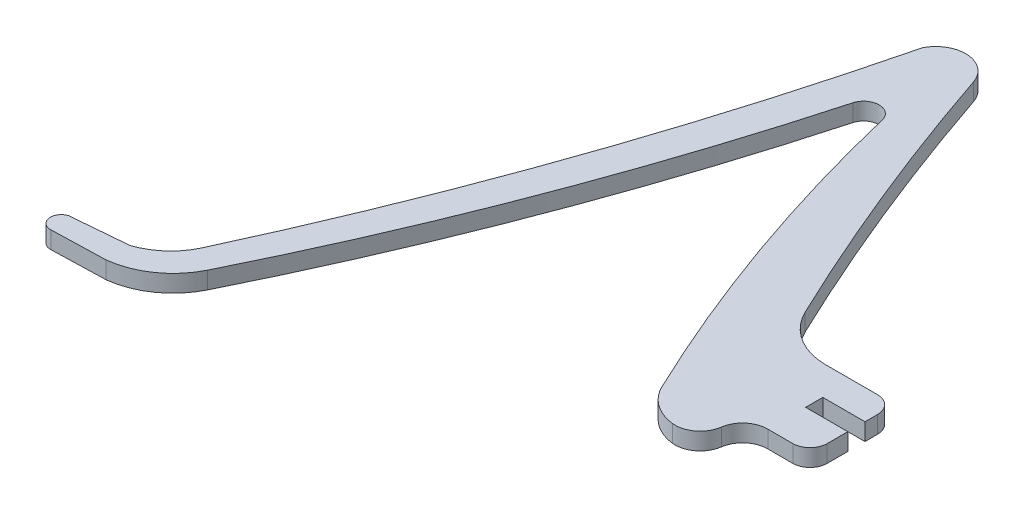
ISO-10303-21;
HEADER;
FILE_DESCRIPTION(('STEP AP214'),'2;1');
FILE_NAME('part.step','',(''),(''),'','','');
FILE_SCHEMA(('AUTOMOTIVE_DESIGN { 1 0 10303 214 1 1 1 1 }'));
ENDSEC;
DATA;
#1=APPLICATION_CONTEXT('core data for automotive mechanical design processes');
#2=APPLICATION_PROTOCOL_DEFINITION('international standard','automotive_design',2000,#1);
#3=PRODUCT_CONTEXT('',#1,'mechanical');
#4=PRODUCT('Part','Part','',(#3));
#5=PRODUCT_RELATED_PRODUCT_CATEGORY('part','',(#4));
#6=PRODUCT_DEFINITION_FORMATION('','',#4);
#7=PRODUCT_DEFINITION_CONTEXT('part definition',#1,'design');
#8=PRODUCT_DEFINITION('design','',#6,#7);
#9=PRODUCT_DEFINITION_SHAPE('','',#8);
#10=(LENGTH_UNIT() NAMED_UNIT(*) SI_UNIT(.MILLI.,.METRE.));
#11=(NAMED_UNIT(*) PLANE_ANGLE_UNIT() SI_UNIT($,.RADIAN.));
#12=(NAMED_UNIT(*) SI_UNIT($,.STERADIAN.) SOLID_ANGLE_UNIT());
#13=UNCERTAINTY_MEASURE_WITH_UNIT(LENGTH_MEASURE(1.E-05),#10,'distance_accuracy_value','');
#14=(GEOMETRIC_REPRESENTATION_CONTEXT(3) GLOBAL_UNCERTAINTY_ASSIGNED_CONTEXT((#13)) GLOBAL_UNIT_ASSIGNED_CONTEXT((#10,
#11,#12)) REPRESENTATION_CONTEXT('',''));
#15=CARTESIAN_POINT('',(0.,0.,0.));
#16=DIRECTION('',(0.,0.,1.));
#17=DIRECTION('',(1.,0.,0.));
#18=AXIS2_PLACEMENT_3D('',#15,#16,#17);
#19=CARTESIAN_POINT('',(-41735.6171870203,3.,-18306.9316403449));
#20=DIRECTION('',(0.,-1.,0.));
#21=DIRECTION('',(0.,0.,-1.));
#22=AXIS2_PLACEMENT_3D('',#19,#20,#21);
#23=CYLINDRICAL_SURFACE('',#22,1.87725100049842);
#24=CARTESIAN_POINT('',(-41735.6171870203,0.,-18306.9316403449));
#25=DIRECTION('',(0.,1.,0.));
#26=DIRECTION('',(0.,0.,1.));
#27=AXIS2_PLACEMENT_3D('',#24,#25,#26);
#28=CIRCLE('',#27,1.87725100049842);
#29=CARTESIAN_POINT('',(-41735.449746,0.,-18308.801409));
#30=VERTEX_POINT('',#29);
#31=CARTESIAN_POINT('',(-41735.564459,0.,-18305.0551299999));
#32=VERTEX_POINT('',#31);
#33=EDGE_CURVE('E227',#30,#32,#28,.T.);
#34=ORIENTED_EDGE('',*,*,#33,.T.);
#35=DIRECTION('',(0.,-1.,0.));
#36=VECTOR('',#35,1.);
#37=CARTESIAN_POINT('',(-41735.564459,3.,-18305.0551299999));
#38=LINE('',#37,#36);
#39=CARTESIAN_POINT('',(-41735.564459,3.,-18305.0551299999));
#40=VERTEX_POINT('',#39);
#41=EDGE_CURVE('E11',#40,#32,#38,.T.);
#42=ORIENTED_EDGE('',*,*,#41,.F.);
#43=CARTESIAN_POINT('',(-41735.6171870203,3.,-18306.9316403449));
#44=DIRECTION('',(0.,1.,0.));
#45=DIRECTION('',(0.,0.,1.));
#46=AXIS2_PLACEMENT_3D('',#43,#44,#45);
#47=CIRCLE('',#46,1.87725100049842);
#48=CARTESIAN_POINT('',(-41735.449746,3.,-18308.801409));
#49=VERTEX_POINT('',#48);
#50=EDGE_CURVE('E273',#49,#40,#47,.T.);
#51=ORIENTED_EDGE('',*,*,#50,.F.);
#52=DIRECTION('',(0.,-1.,0.));
#53=VECTOR('',#52,1.);
#54=CARTESIAN_POINT('',(-41735.449746,3.,-18308.801409));
#55=LINE('',#54,#53);
#56=EDGE_CURVE('E223',#49,#30,#55,.T.);
#57=ORIENTED_EDGE('',*,*,#56,.T.);
#58=EDGE_LOOP('',(#34,#42,#51,#57));
#59=FACE_BOUND('',#58,.T.);
#60=ADVANCED_FACE('F35',(#59),#23,.T.);
#61=CARTESIAN_POINT('',(-41735.564459,3.,-18305.0551299999));
#62=DIRECTION('',(-0.0283589565752773,0.,-0.999597803910133));
#63=DIRECTION('',(-0.999597803910133,0.,0.0283589565752773));
#64=AXIS2_PLACEMENT_3D('',#61,#62,#63);
#65=PLANE('',#64);
#66=DIRECTION('',(0.999597803910133,0.,-0.0283589565752773));
#67=VECTOR('',#66,1.);
#68=CARTESIAN_POINT('',(-41735.564459,0.,-18305.0551299999));
#69=LINE('',#68,#67);
#70=CARTESIAN_POINT('',(-41726.148437,0.,-18305.322266));
#71=VERTEX_POINT('',#70);
#72=EDGE_CURVE('E230',#32,#71,#69,.T.);
#73=ORIENTED_EDGE('',*,*,#72,.T.);
#74=DIRECTION('',(0.,-1.,0.));
#75=VECTOR('',#74,1.);
#76=CARTESIAN_POINT('',(-41726.148437,3.,-18305.322266));
#77=LINE('',#76,#75);
#78=CARTESIAN_POINT('',(-41726.148437,3.,-18305.322266));
#79=VERTEX_POINT('',#78);
#80=EDGE_CURVE('E43',#79,#71,#77,.T.);
#81=ORIENTED_EDGE('',*,*,#80,.F.);
#82=DIRECTION('',(0.999597803910133,0.,-0.0283589565752773));
#83=VECTOR('',#82,1.);
#84=CARTESIAN_POINT('',(-41735.564459,3.,-18305.0551299999));
#85=LINE('',#84,#83);
#86=EDGE_CURVE('E142',#40,#79,#85,.T.);
#87=ORIENTED_EDGE('',*,*,#86,.F.);
#88=ORIENTED_EDGE('',*,*,#41,.T.);
#89=EDGE_LOOP('',(#73,#81,#87,#88));
#90=FACE_BOUND('',#89,.T.);
#91=ADVANCED_FACE('F411',(#90),#65,.F.);
#92=CARTESIAN_POINT('',(-41727.6904464803,3.,-18318.5260678972));
#93=DIRECTION('',(0.,-1.,0.));
#94=DIRECTION('',(0.,0.,-1.));
#95=AXIS2_PLACEMENT_3D('',#92,#93,#94);
#96=CYLINDRICAL_SURFACE('',#95,13.2935389486009);
#97=CARTESIAN_POINT('',(-41727.6904464803,0.,-18318.5260678972));
#98=DIRECTION('',(0.,1.,0.));
#99=DIRECTION('',(0.,0.,1.));
#100=AXIS2_PLACEMENT_3D('',#97,#98,#99);
#101=CIRCLE('',#100,13.2935389486009);
#102=CARTESIAN_POINT('',(-41715.768727,0.,-18312.644675));
#103=VERTEX_POINT('',#102);
#104=EDGE_CURVE('E232',#71,#103,#101,.T.);
#105=ORIENTED_EDGE('',*,*,#104,.T.);
#106=DIRECTION('',(0.,-1.,0.));
#107=VECTOR('',#106,1.);
#108=CARTESIAN_POINT('',(-41715.768727,3.,-18312.644675));
#109=LINE('',#108,#107);
#110=CARTESIAN_POINT('',(-41715.768727,3.,-18312.644675));
#111=VERTEX_POINT('',#110);
#112=EDGE_CURVE('E328',#111,#103,#109,.T.);
#113=ORIENTED_EDGE('',*,*,#112,.F.);
#114=CARTESIAN_POINT('',(-41727.6904464803,3.,-18318.5260678972));
#115=DIRECTION('',(0.,1.,0.));
#116=DIRECTION('',(0.,0.,1.));
#117=AXIS2_PLACEMENT_3D('',#114,#115,#116);
#118=CIRCLE('',#117,13.2935389486009);
#119=EDGE_CURVE('E336',#79,#111,#118,.T.);
#120=ORIENTED_EDGE('',*,*,#119,.F.);
#121=ORIENTED_EDGE('',*,*,#80,.T.);
#122=EDGE_LOOP('',(#105,#113,#120,#121));
#123=FACE_BOUND('',#122,.T.);
#124=ADVANCED_FACE('F334',(#123),#96,.T.);
#125=CARTESIAN_POINT('',(-42128.664315329,3.,-18516.2507745497));
#126=DIRECTION('',(0.,-1.,0.));
#127=DIRECTION('',(0.,0.,-1.));
#128=AXIS2_PLACEMENT_3D('',#125,#126,#127);
#129=CYLINDRICAL_SURFACE('',#128,460.367473476799);
#130=CARTESIAN_POINT('',(-42128.664315329,0.,-18516.2507745497));
#131=DIRECTION('',(0.,1.,0.));
#132=DIRECTION('',(0.,0.,1.));
#133=AXIS2_PLACEMENT_3D('',#130,#131,#132);
#134=CIRCLE('',#133,460.367473476799);
#135=CARTESIAN_POINT('',(-41684.7597910001,0.,-18394.2385459997));
#136=VERTEX_POINT('',#135);
#137=EDGE_CURVE('E234',#103,#136,#134,.T.);
#138=ORIENTED_EDGE('',*,*,#137,.T.);
#139=DIRECTION('',(0.,-1.,0.));
#140=VECTOR('',#139,1.);
#141=CARTESIAN_POINT('',(-41684.7597910001,3.,-18394.2385459997));
#142=LINE('',#141,#140);
#143=CARTESIAN_POINT('',(-41684.7597910001,3.,-18394.2385459997));
#144=VERTEX_POINT('',#143);
#145=EDGE_CURVE('E325',#144,#136,#142,.T.);
#146=ORIENTED_EDGE('',*,*,#145,.F.);
#147=CARTESIAN_POINT('',(-42128.664315329,3.,-18516.2507745497));
#148=DIRECTION('',(0.,1.,0.));
#149=DIRECTION('',(0.,0.,1.));
#150=AXIS2_PLACEMENT_3D('',#147,#148,#149);
#151=CIRCLE('',#150,460.367473476799);
#152=EDGE_CURVE('E354',#111,#144,#151,.T.);
#153=ORIENTED_EDGE('',*,*,#152,.F.);
#154=ORIENTED_EDGE('',*,*,#112,.T.);
#155=EDGE_LOOP('',(#138,#146,#153,#154));
#156=FACE_BOUND('',#155,.T.);
#157=ADVANCED_FACE('F345',(#156),#129,.T.);
#158=CARTESIAN_POINT('',(-41682.1651776017,3.,-18393.5253188146));
#159=DIRECTION('',(0.,-1.,0.));
#160=DIRECTION('',(0.,0.,-1.));
#161=AXIS2_PLACEMENT_3D('',#158,#159,#160);
#162=CYLINDRICAL_SURFACE('',#161,2.69085705763481);
#163=CARTESIAN_POINT('',(-41682.1651776017,0.,-18393.5253188146));
#164=DIRECTION('',(0.,-1.,0.));
#165=DIRECTION('',(0.,0.,1.));
#166=AXIS2_PLACEMENT_3D('',#163,#164,#165);
#167=CIRCLE('',#166,2.69085705763481);
#168=CARTESIAN_POINT('',(-41679.684114,0.,-18394.566969));
#169=VERTEX_POINT('',#168);
#170=EDGE_CURVE('E236',#136,#169,#167,.T.);
#171=ORIENTED_EDGE('',*,*,#170,.T.);
#172=DIRECTION('',(0.,-1.,0.));
#173=VECTOR('',#172,1.);
#174=CARTESIAN_POINT('',(-41679.684114,3.,-18394.566969));
#175=LINE('',#174,#173);
#176=CARTESIAN_POINT('',(-41679.684114,3.,-18394.566969));
#177=VERTEX_POINT('',#176);
#178=EDGE_CURVE('E322',#177,#169,#175,.T.);
#179=ORIENTED_EDGE('',*,*,#178,.F.);
#180=CARTESIAN_POINT('',(-41682.1651776017,3.,-18393.5253188146));
#181=DIRECTION('',(0.,-1.,0.));
#182=DIRECTION('',(0.,0.,1.));
#183=AXIS2_PLACEMENT_3D('',#180,#181,#182);
#184=CIRCLE('',#183,2.69085705763481);
#185=EDGE_CURVE('E351',#144,#177,#184,.T.);
#186=ORIENTED_EDGE('',*,*,#185,.F.);
#187=ORIENTED_EDGE('',*,*,#145,.T.);
#188=EDGE_LOOP('',(#171,#179,#186,#187));
#189=FACE_BOUND('',#188,.T.);
#190=ADVANCED_FACE('F349',(#189),#162,.F.);
#191=CARTESIAN_POINT('',(-41387.5661853201,3.,-18464.1934135476));
#192=DIRECTION('',(0.,-1.,0.));
#193=DIRECTION('',(0.,0.,-1.));
#194=AXIS2_PLACEMENT_3D('',#191,#192,#193);
#195=CYLINDRICAL_SURFACE('',#194,300.3010590001);
#196=CARTESIAN_POINT('',(-41387.5661853201,0.,-18464.1934135476));
#197=DIRECTION('',(0.,1.,0.));
#198=DIRECTION('',(0.,0.,1.));
#199=AXIS2_PLACEMENT_3D('',#196,#197,#198);
#200=CIRCLE('',#199,300.3010590001);
#201=CARTESIAN_POINT('',(-41658.479214,0.,-18334.6293100001));
#202=VERTEX_POINT('',#201);
#203=EDGE_CURVE('E238',#169,#202,#200,.T.);
#204=ORIENTED_EDGE('',*,*,#203,.T.);
#205=DIRECTION('',(0.,-1.,0.));
#206=VECTOR('',#205,1.);
#207=CARTESIAN_POINT('',(-41658.479214,3.,-18334.6293100001));
#208=LINE('',#207,#206);
#209=CARTESIAN_POINT('',(-41658.479214,3.,-18334.6293100001));
#210=VERTEX_POINT('',#209);
#211=EDGE_CURVE('E319',#210,#202,#208,.T.);
#212=ORIENTED_EDGE('',*,*,#211,.F.);
#213=CARTESIAN_POINT('',(-41387.5661853201,3.,-18464.1934135476));
#214=DIRECTION('',(0.,1.,0.));
#215=DIRECTION('',(0.,0.,1.));
#216=AXIS2_PLACEMENT_3D('',#213,#214,#215);
#217=CIRCLE('',#216,300.3010590001);
#218=EDGE_CURVE('E353',#177,#210,#217,.T.);
#219=ORIENTED_EDGE('',*,*,#218,.F.);
#220=ORIENTED_EDGE('',*,*,#178,.T.);
#221=EDGE_LOOP('',(#204,#212,#219,#220));
#222=FACE_BOUND('',#221,.T.);
#223=ADVANCED_FACE('F424',(#222),#195,.T.);
#224=CARTESIAN_POINT('',(-41651.0954421731,3.,-18338.1613657782));
#225=DIRECTION('',(0.,-1.,0.));
#226=DIRECTION('',(0.,0.,-1.));
#227=AXIS2_PLACEMENT_3D('',#224,#225,#226);
#228=CYLINDRICAL_SURFACE('',#227,8.18507815550071);
#229=CARTESIAN_POINT('',(-41651.0954421731,0.,-18338.1613657782));
#230=DIRECTION('',(0.,1.,0.));
#231=DIRECTION('',(0.,0.,1.));
#232=AXIS2_PLACEMENT_3D('',#229,#230,#231);
#233=CIRCLE('',#232,8.18507815550071);
#234=CARTESIAN_POINT('',(-41652.048728,0.,-18330.03199));
#235=VERTEX_POINT('',#234);
#236=EDGE_CURVE('E240',#202,#235,#233,.T.);
#237=ORIENTED_EDGE('',*,*,#236,.T.);
#238=DIRECTION('',(0.,-1.,0.));
#239=VECTOR('',#238,1.);
#240=CARTESIAN_POINT('',(-41652.048728,3.,-18330.03199));
#241=LINE('',#240,#239);
#242=CARTESIAN_POINT('',(-41652.048728,3.,-18330.03199));
#243=VERTEX_POINT('',#242);
#244=EDGE_CURVE('E316',#243,#235,#241,.T.);
#245=ORIENTED_EDGE('',*,*,#244,.F.);
#246=CARTESIAN_POINT('',(-41651.0954421731,3.,-18338.1613657782));
#247=DIRECTION('',(0.,1.,0.));
#248=DIRECTION('',(0.,0.,1.));
#249=AXIS2_PLACEMENT_3D('',#246,#247,#248);
#250=CIRCLE('',#249,8.18507815550071);
#251=EDGE_CURVE('E356',#210,#243,#250,.T.);
#252=ORIENTED_EDGE('',*,*,#251,.F.);
#253=ORIENTED_EDGE('',*,*,#211,.T.);
#254=EDGE_LOOP('',(#237,#245,#252,#253));
#255=FACE_BOUND('',#254,.T.);
#256=ADVANCED_FACE('F427',(#255),#228,.T.);
#257=CARTESIAN_POINT('',(-41651.5397496867,3.,-18334.3725173959));
#258=DIRECTION('',(0.,-1.,0.));
#259=DIRECTION('',(0.,0.,-1.));
#260=AXIS2_PLACEMENT_3D('',#257,#258,#259);
#261=CYLINDRICAL_SURFACE('',#260,4.37026738290053);
#262=CARTESIAN_POINT('',(-41651.5397496867,0.,-18334.3725173959));
#263=DIRECTION('',(0.,1.,0.));
#264=DIRECTION('',(0.,0.,1.));
#265=AXIS2_PLACEMENT_3D('',#262,#263,#264);
#266=CIRCLE('',#265,4.37026738290053);
#267=CARTESIAN_POINT('',(-41647.213194,0.,-18333.755952));
#268=VERTEX_POINT('',#267);
#269=EDGE_CURVE('E242',#235,#268,#266,.T.);
#270=ORIENTED_EDGE('',*,*,#269,.T.);
#271=DIRECTION('',(0.,-1.,0.));
#272=VECTOR('',#271,1.);
#273=CARTESIAN_POINT('',(-41647.213194,3.,-18333.755952));
#274=LINE('',#273,#272);
#275=CARTESIAN_POINT('',(-41647.213194,3.,-18333.755952));
#276=VERTEX_POINT('',#275);
#277=EDGE_CURVE('E313',#276,#268,#274,.T.);
#278=ORIENTED_EDGE('',*,*,#277,.F.);
#279=CARTESIAN_POINT('',(-41651.5397496867,3.,-18334.3725173959));
#280=DIRECTION('',(0.,1.,0.));
#281=DIRECTION('',(0.,0.,1.));
#282=AXIS2_PLACEMENT_3D('',#279,#280,#281);
#283=CIRCLE('',#282,4.37026738290053);
#284=EDGE_CURVE('E362',#243,#276,#283,.T.);
#285=ORIENTED_EDGE('',*,*,#284,.F.);
#286=ORIENTED_EDGE('',*,*,#244,.T.);
#287=EDGE_LOOP('',(#270,#278,#285,#286));
#288=FACE_BOUND('',#287,.T.);
#289=ADVANCED_FACE('F431',(#288),#261,.T.);
#290=CARTESIAN_POINT('',(-41642.9001352319,3.,-18333.1391655801));
#291=DIRECTION('',(0.,-1.,0.));
#292=DIRECTION('',(0.,0.,-1.));
#293=AXIS2_PLACEMENT_3D('',#290,#291,#292);
#294=CYLINDRICAL_SURFACE('',#293,4.35693716096743);
#295=CARTESIAN_POINT('',(-41642.9001352319,0.,-18333.1391655801));
#296=DIRECTION('',(0.,-1.,0.));
#297=DIRECTION('',(0.,0.,1.));
#298=AXIS2_PLACEMENT_3D('',#295,#296,#297);
#299=CIRCLE('',#298,4.35693716096743);
#300=CARTESIAN_POINT('',(-41642.8612260001,0.,-18337.495929));
#301=VERTEX_POINT('',#300);
#302=EDGE_CURVE('E244',#268,#301,#299,.T.);
#303=ORIENTED_EDGE('',*,*,#302,.T.);
#304=DIRECTION('',(0.,-1.,0.));
#305=VECTOR('',#304,1.);
#306=CARTESIAN_POINT('',(-41642.8612260001,3.,-18337.495929));
#307=LINE('',#306,#305);
#308=CARTESIAN_POINT('',(-41642.8612260001,3.,-18337.495929));
#309=VERTEX_POINT('',#308);
#310=EDGE_CURVE('E310',#309,#301,#307,.T.);
#311=ORIENTED_EDGE('',*,*,#310,.F.);
#312=CARTESIAN_POINT('',(-41642.9001352319,3.,-18333.1391655801));
#313=DIRECTION('',(0.,-1.,0.));
#314=DIRECTION('',(0.,0.,1.));
#315=AXIS2_PLACEMENT_3D('',#312,#313,#314);
#316=CIRCLE('',#315,4.35693716096743);
#317=EDGE_CURVE('E364',#276,#309,#316,.T.);
#318=ORIENTED_EDGE('',*,*,#317,.F.);
#319=ORIENTED_EDGE('',*,*,#277,.T.);
#320=EDGE_LOOP('',(#303,#311,#318,#319));
#321=FACE_BOUND('',#320,.T.);
#322=ADVANCED_FACE('F435',(#321),#294,.F.);
#323=CARTESIAN_POINT('',(-41642.8612260001,3.,-18337.495929));
#324=DIRECTION('',(-3.7732018572046E-05,0.,-0.999999999288147));
#325=DIRECTION('',(-0.999999999288147,0.,3.7732018572046E-05));
#326=AXIS2_PLACEMENT_3D('',#323,#324,#325);
#327=PLANE('',#326);
#328=DIRECTION('',(0.999999999288147,0.,-3.7732018572046E-05));
#329=VECTOR('',#328,1.);
#330=CARTESIAN_POINT('',(-41642.8612260001,0.,-18337.495929));
#331=LINE('',#330,#329);
#332=CARTESIAN_POINT('',(-41638.488281,0.,-18337.496094));
#333=VERTEX_POINT('',#332);
#334=EDGE_CURVE('E246',#301,#333,#331,.T.);
#335=ORIENTED_EDGE('',*,*,#334,.T.);
#336=DIRECTION('',(0.,-1.,0.));
#337=VECTOR('',#336,1.);
#338=CARTESIAN_POINT('',(-41638.488281,3.,-18337.496094));
#339=LINE('',#338,#337);
#340=CARTESIAN_POINT('',(-41638.488281,3.,-18337.496094));
#341=VERTEX_POINT('',#340);
#342=EDGE_CURVE('E307',#341,#333,#339,.T.);
#343=ORIENTED_EDGE('',*,*,#342,.F.);
#344=DIRECTION('',(0.999999999288147,0.,-3.7732018572046E-05));
#345=VECTOR('',#344,1.);
#346=CARTESIAN_POINT('',(-41642.8612260001,3.,-18337.495929));
#347=LINE('',#346,#345);
#348=EDGE_CURVE('E366',#309,#341,#347,.T.);
#349=ORIENTED_EDGE('',*,*,#348,.F.);
#350=ORIENTED_EDGE('',*,*,#310,.T.);
#351=EDGE_LOOP('',(#335,#343,#349,#350));
#352=FACE_BOUND('',#351,.T.);
#353=ADVANCED_FACE('F439',(#352),#327,.F.);
#354=CARTESIAN_POINT('',(-41638.4892569775,3.,-18340.4970698828));
#355=DIRECTION('',(0.,-1.,0.));
#356=DIRECTION('',(0.,0.,-1.));
#357=AXIS2_PLACEMENT_3D('',#354,#355,#356);
#358=CYLINDRICAL_SURFACE('',#357,3.00097604150021);
#359=CARTESIAN_POINT('',(-41638.4892569775,0.,-18340.4970698828));
#360=DIRECTION('',(0.,1.,0.));
#361=DIRECTION('',(0.,0.,1.));
#362=AXIS2_PLACEMENT_3D('',#359,#360,#361);
#363=CIRCLE('',#362,3.00097604150021);
#364=CARTESIAN_POINT('',(-41635.488282,0.,-18340.499597));
#365=VERTEX_POINT('',#364);
#366=EDGE_CURVE('E248',#333,#365,#363,.T.);
#367=ORIENTED_EDGE('',*,*,#366,.T.);
#368=DIRECTION('',(0.,-1.,0.));
#369=VECTOR('',#368,1.);
#370=CARTESIAN_POINT('',(-41635.488282,3.,-18340.499597));
#371=LINE('',#370,#369);
#372=CARTESIAN_POINT('',(-41635.488282,3.,-18340.499597));
#373=VERTEX_POINT('',#372);
#374=EDGE_CURVE('E304',#373,#365,#371,.T.);
#375=ORIENTED_EDGE('',*,*,#374,.F.);
#376=CARTESIAN_POINT('',(-41638.4892569775,3.,-18340.4970698828));
#377=DIRECTION('',(0.,1.,0.));
#378=DIRECTION('',(0.,0.,1.));
#379=AXIS2_PLACEMENT_3D('',#376,#377,#378);
#380=CIRCLE('',#379,3.00097604150021);
#381=EDGE_CURVE('E368',#341,#373,#380,.T.);
#382=ORIENTED_EDGE('',*,*,#381,.F.);
#383=ORIENTED_EDGE('',*,*,#342,.T.);
#384=EDGE_LOOP('',(#367,#375,#382,#383));
#385=FACE_BOUND('',#384,.T.);
#386=ADVANCED_FACE('F443',(#385),#358,.T.);
#387=CARTESIAN_POINT('',(-41635.488282,3.,-18340.499597));
#388=DIRECTION('',(-0.999999999999961,0.,-2.78240565328262E-07));
#389=DIRECTION('',(-2.78240565328262E-07,0.,0.999999999999961));
#390=AXIS2_PLACEMENT_3D('',#387,#388,#389);
#391=PLANE('',#390);
#392=DIRECTION('',(2.78240565328262E-07,0.,-0.999999999999961));
#393=VECTOR('',#392,1.);
#394=CARTESIAN_POINT('',(-41635.488282,0.,-18340.499597));
#395=LINE('',#394,#393);
#396=CARTESIAN_POINT('',(-41635.488281,0.,-18344.09375));
#397=VERTEX_POINT('',#396);
#398=EDGE_CURVE('E250',#365,#397,#395,.T.);
#399=ORIENTED_EDGE('',*,*,#398,.T.);
#400=DIRECTION('',(0.,-1.,0.));
#401=VECTOR('',#400,1.);
#402=CARTESIAN_POINT('',(-41635.488281,3.,-18344.09375));
#403=LINE('',#402,#401);
#404=CARTESIAN_POINT('',(-41635.488281,3.,-18344.09375));
#405=VERTEX_POINT('',#404);
#406=EDGE_CURVE('E301',#405,#397,#403,.T.);
#407=ORIENTED_EDGE('',*,*,#406,.F.);
#408=DIRECTION('',(2.78240565328262E-07,0.,-0.999999999999961));
#409=VECTOR('',#408,1.);
#410=CARTESIAN_POINT('',(-41635.488282,3.,-18340.499597));
#411=LINE('',#410,#409);
#412=EDGE_CURVE('E370',#373,#405,#411,.T.);
#413=ORIENTED_EDGE('',*,*,#412,.F.);
#414=ORIENTED_EDGE('',*,*,#374,.T.);
#415=EDGE_LOOP('',(#399,#407,#413,#414));
#416=FACE_BOUND('',#415,.T.);
#417=ADVANCED_FACE('F447',(#416),#391,.F.);
#418=CARTESIAN_POINT('',(-41635.488281,3.,-18344.09375));
#419=DIRECTION('',(0.,0.,1.));
#420=DIRECTION('',(1.,0.,0.));
#421=AXIS2_PLACEMENT_3D('',#418,#419,#420);
#422=PLANE('',#421);
#423=DIRECTION('',(-1.,0.,0.));
#424=VECTOR('',#423,1.);
#425=CARTESIAN_POINT('',(-41635.488281,0.,-18344.09375));
#426=LINE('',#425,#424);
#427=CARTESIAN_POINT('',(-41642.851562,0.,-18344.09375));
#428=VERTEX_POINT('',#427);
#429=EDGE_CURVE('E252',#397,#428,#426,.T.);
#430=ORIENTED_EDGE('',*,*,#429,.T.);
#431=DIRECTION('',(0.,-1.,0.));
#432=VECTOR('',#431,1.);
#433=CARTESIAN_POINT('',(-41642.851562,3.,-18344.09375));
#434=LINE('',#433,#432);
#435=CARTESIAN_POINT('',(-41642.851562,3.,-18344.09375));
#436=VERTEX_POINT('',#435);
#437=EDGE_CURVE('E298',#436,#428,#434,.T.);
#438=ORIENTED_EDGE('',*,*,#437,.F.);
#439=DIRECTION('',(-1.,0.,0.));
#440=VECTOR('',#439,1.);
#441=CARTESIAN_POINT('',(-41635.488281,3.,-18344.09375));
#442=LINE('',#441,#440);
#443=EDGE_CURVE('E372',#405,#436,#442,.T.);
#444=ORIENTED_EDGE('',*,*,#443,.F.);
#445=ORIENTED_EDGE('',*,*,#406,.T.);
#446=EDGE_LOOP('',(#430,#438,#444,#445));
#447=FACE_BOUND('',#446,.T.);
#448=ADVANCED_FACE('F451',(#447),#422,.F.);
#449=CARTESIAN_POINT('',(-41642.851562,3.,-18344.09375));
#450=DIRECTION('',(-0.999999151965023,0.,0.00130233222889896));
#451=DIRECTION('',(0.00130233222889896,0.,0.999999151965023));
#452=AXIS2_PLACEMENT_3D('',#449,#450,#451);
#453=PLANE('',#452);
#454=DIRECTION('',(-0.00130233222889896,0.,-0.999999151965023));
#455=VECTOR('',#454,1.);
#456=CARTESIAN_POINT('',(-41642.851562,0.,-18344.09375));
#457=LINE('',#456,#455);
#458=CARTESIAN_POINT('',(-41642.855469,0.,-18347.09375));
#459=VERTEX_POINT('',#458);
#460=EDGE_CURVE('E254',#428,#459,#457,.T.);
#461=ORIENTED_EDGE('',*,*,#460,.T.);
#462=DIRECTION('',(0.,-1.,0.));
#463=VECTOR('',#462,1.);
#464=CARTESIAN_POINT('',(-41642.855469,3.,-18347.09375));
#465=LINE('',#464,#463);
#466=CARTESIAN_POINT('',(-41642.855469,3.,-18347.09375));
#467=VERTEX_POINT('',#466);
#468=EDGE_CURVE('E295',#467,#459,#465,.T.);
#469=ORIENTED_EDGE('',*,*,#468,.F.);
#470=DIRECTION('',(-0.00130233222889896,0.,-0.999999151965023));
#471=VECTOR('',#470,1.);
#472=CARTESIAN_POINT('',(-41642.851562,3.,-18344.09375));
#473=LINE('',#472,#471);
#474=EDGE_CURVE('E374',#436,#467,#473,.T.);
#475=ORIENTED_EDGE('',*,*,#474,.F.);
#476=ORIENTED_EDGE('',*,*,#437,.T.);
#477=EDGE_LOOP('',(#461,#469,#475,#476));
#478=FACE_BOUND('',#477,.T.);
#479=ADVANCED_FACE('F455',(#478),#453,.F.);
#480=CARTESIAN_POINT('',(-41642.855469,3.,-18347.09375));
#481=DIRECTION('',(0.,0.,-1.));
#482=DIRECTION('',(-1.,0.,0.));
#483=AXIS2_PLACEMENT_3D('',#480,#481,#482);
#484=PLANE('',#483);
#485=DIRECTION('',(1.,0.,0.));
#486=VECTOR('',#485,1.);
#487=CARTESIAN_POINT('',(-41642.855469,0.,-18347.09375));
#488=LINE('',#487,#486);
#489=CARTESIAN_POINT('',(-41635.492187,0.,-18347.09375));
#490=VERTEX_POINT('',#489);
#491=EDGE_CURVE('E256',#459,#490,#488,.T.);
#492=ORIENTED_EDGE('',*,*,#491,.T.);
#493=DIRECTION('',(0.,-1.,0.));
#494=VECTOR('',#493,1.);
#495=CARTESIAN_POINT('',(-41635.492187,3.,-18347.09375));
#496=LINE('',#495,#494);
#497=CARTESIAN_POINT('',(-41635.492187,3.,-18347.09375));
#498=VERTEX_POINT('',#497);
#499=EDGE_CURVE('E292',#498,#490,#496,.T.);
#500=ORIENTED_EDGE('',*,*,#499,.F.);
#501=DIRECTION('',(1.,0.,0.));
#502=VECTOR('',#501,1.);
#503=CARTESIAN_POINT('',(-41642.855469,3.,-18347.09375));
#504=LINE('',#503,#502);
#505=EDGE_CURVE('E376',#467,#498,#504,.T.);
#506=ORIENTED_EDGE('',*,*,#505,.F.);
#507=ORIENTED_EDGE('',*,*,#468,.T.);
#508=EDGE_LOOP('',(#492,#500,#506,#507));
#509=FACE_BOUND('',#508,.T.);
#510=ADVANCED_FACE('F459',(#509),#484,.F.);
#511=CARTESIAN_POINT('',(-41635.492187,3.,-18347.09375));
#512=DIRECTION('',(-0.999998402969752,0.,-0.00178719275560463));
#513=DIRECTION('',(-0.00178719275560463,0.,0.999998402969752));
#514=AXIS2_PLACEMENT_3D('',#511,#512,#513);
#515=PLANE('',#514);
#516=DIRECTION('',(0.00178719275560463,0.,-0.999998402969752));
#517=VECTOR('',#516,1.);
#518=CARTESIAN_POINT('',(-41635.492187,0.,-18347.09375));
#519=LINE('',#518,#517);
#520=CARTESIAN_POINT('',(-41635.488281,0.,-18349.279297));
#521=VERTEX_POINT('',#520);
#522=EDGE_CURVE('E258',#490,#521,#519,.T.);
#523=ORIENTED_EDGE('',*,*,#522,.T.);
#524=DIRECTION('',(0.,-1.,0.));
#525=VECTOR('',#524,1.);
#526=CARTESIAN_POINT('',(-41635.488281,3.,-18349.279297));
#527=LINE('',#526,#525);
#528=CARTESIAN_POINT('',(-41635.488281,3.,-18349.279297));
#529=VERTEX_POINT('',#528);
#530=EDGE_CURVE('E289',#529,#521,#527,.T.);
#531=ORIENTED_EDGE('',*,*,#530,.F.);
#532=DIRECTION('',(0.00178719275560463,0.,-0.999998402969752));
#533=VECTOR('',#532,1.);
#534=CARTESIAN_POINT('',(-41635.492187,3.,-18347.09375));
#535=LINE('',#534,#533);
#536=EDGE_CURVE('E378',#498,#529,#535,.T.);
#537=ORIENTED_EDGE('',*,*,#536,.F.);
#538=ORIENTED_EDGE('',*,*,#499,.T.);
#539=EDGE_LOOP('',(#523,#531,#537,#538));
#540=FACE_BOUND('',#539,.T.);
#541=ADVANCED_FACE('F463',(#540),#515,.F.);
#542=CARTESIAN_POINT('',(-41638.4902327302,3.,-18349.2773452721));
#543=DIRECTION('',(0.,-1.,0.));
#544=DIRECTION('',(0.,0.,-1.));
#545=AXIS2_PLACEMENT_3D('',#542,#543,#544);
#546=CYLINDRICAL_SURFACE('',#545,3.001952364701);
#547=CARTESIAN_POINT('',(-41638.4902327302,0.,-18349.2773452721));
#548=DIRECTION('',(0.,1.,0.));
#549=DIRECTION('',(0.,0.,1.));
#550=AXIS2_PLACEMENT_3D('',#547,#548,#549);
#551=CIRCLE('',#550,3.001952364701);
#552=CARTESIAN_POINT('',(-41638.492188,0.,-18352.279297));
#553=VERTEX_POINT('',#552);
#554=EDGE_CURVE('E260',#521,#553,#551,.T.);
#555=ORIENTED_EDGE('',*,*,#554,.T.);
#556=DIRECTION('',(0.,-1.,0.));
#557=VECTOR('',#556,1.);
#558=CARTESIAN_POINT('',(-41638.492188,3.,-18352.279297));
#559=LINE('',#558,#557);
#560=CARTESIAN_POINT('',(-41638.492188,3.,-18352.279297));
#561=VERTEX_POINT('',#560);
#562=EDGE_CURVE('E286',#561,#553,#559,.T.);
#563=ORIENTED_EDGE('',*,*,#562,.F.);
#564=CARTESIAN_POINT('',(-41638.4902327302,3.,-18349.2773452721));
#565=DIRECTION('',(0.,1.,0.));
#566=DIRECTION('',(0.,0.,1.));
#567=AXIS2_PLACEMENT_3D('',#564,#565,#566);
#568=CIRCLE('',#567,3.001952364701);
#569=EDGE_CURVE('E380',#529,#561,#568,.T.);
#570=ORIENTED_EDGE('',*,*,#569,.F.);
#571=ORIENTED_EDGE('',*,*,#530,.T.);
#572=EDGE_LOOP('',(#555,#563,#570,#571));
#573=FACE_BOUND('',#572,.T.);
#574=ADVANCED_FACE('F467',(#573),#546,.T.);
#575=CARTESIAN_POINT('',(-41638.492188,3.,-18352.279297));
#576=DIRECTION('',(0.000209982365753236,0.,0.999999977953703));
#577=DIRECTION('',(0.999999977953703,0.,-0.000209982365753236));
#578=AXIS2_PLACEMENT_3D('',#575,#576,#577);
#579=PLANE('',#578);
#580=DIRECTION('',(-0.999999977953703,0.,0.000209982365753236));
#581=VECTOR('',#580,1.);
#582=CARTESIAN_POINT('',(-41638.492188,0.,-18352.279297));
#583=LINE('',#582,#581);
#584=CARTESIAN_POINT('',(-41647.792969,0.,-18352.277344));
#585=VERTEX_POINT('',#584);
#586=EDGE_CURVE('E262',#553,#585,#583,.T.);
#587=ORIENTED_EDGE('',*,*,#586,.T.);
#588=DIRECTION('',(0.,-1.,0.));
#589=VECTOR('',#588,1.);
#590=CARTESIAN_POINT('',(-41647.792969,3.,-18352.277344));
#591=LINE('',#590,#589);
#592=CARTESIAN_POINT('',(-41647.792969,3.,-18352.277344));
#593=VERTEX_POINT('',#592);
#594=EDGE_CURVE('E283',#593,#585,#591,.T.);
#595=ORIENTED_EDGE('',*,*,#594,.F.);
#596=DIRECTION('',(-0.999999977953703,0.,0.000209982365753236));
#597=VECTOR('',#596,1.);
#598=CARTESIAN_POINT('',(-41638.492188,3.,-18352.279297));
#599=LINE('',#598,#597);
#600=EDGE_CURVE('E382',#561,#593,#599,.T.);
#601=ORIENTED_EDGE('',*,*,#600,.F.);
#602=ORIENTED_EDGE('',*,*,#562,.T.);
#603=EDGE_LOOP('',(#587,#595,#601,#602));
#604=FACE_BOUND('',#603,.T.);
#605=ADVANCED_FACE('F471',(#604),#579,.F.);
#606=CARTESIAN_POINT('',(-41647.4903107809,3.,-18363.1296391762));
#607=DIRECTION('',(0.,-1.,0.));
#608=DIRECTION('',(0.,0.,-1.));
#609=AXIS2_PLACEMENT_3D('',#606,#607,#608);
#610=CYLINDRICAL_SURFACE('',#609,10.8565147533115);
#611=CARTESIAN_POINT('',(-41647.4903107809,0.,-18363.1296391762));
#612=DIRECTION('',(0.,-1.,0.));
#613=DIRECTION('',(0.,0.,1.));
#614=AXIS2_PLACEMENT_3D('',#611,#612,#613);
#615=CIRCLE('',#614,10.8565147533115);
#616=CARTESIAN_POINT('',(-41657.286164,0.,-18358.4493429999));
#617=VERTEX_POINT('',#616);
#618=EDGE_CURVE('E264',#585,#617,#615,.T.);
#619=ORIENTED_EDGE('',*,*,#618,.T.);
#620=DIRECTION('',(0.,-1.,0.));
#621=VECTOR('',#620,1.);
#622=CARTESIAN_POINT('',(-41657.286164,3.,-18358.4493429999));
#623=LINE('',#622,#621);
#624=CARTESIAN_POINT('',(-41657.286164,3.,-18358.4493429999));
#625=VERTEX_POINT('',#624);
#626=EDGE_CURVE('E280',#625,#617,#623,.T.);
#627=ORIENTED_EDGE('',*,*,#626,.F.);
#628=CARTESIAN_POINT('',(-41647.4903107809,3.,-18363.1296391762));
#629=DIRECTION('',(0.,-1.,0.));
#630=DIRECTION('',(0.,0.,1.));
#631=AXIS2_PLACEMENT_3D('',#628,#629,#630);
#632=CIRCLE('',#631,10.8565147533115);
#633=EDGE_CURVE('E384',#593,#625,#632,.T.);
#634=ORIENTED_EDGE('',*,*,#633,.F.);
#635=ORIENTED_EDGE('',*,*,#594,.T.);
#636=EDGE_LOOP('',(#619,#627,#634,#635));
#637=FACE_BOUND('',#636,.T.);
#638=ADVANCED_FACE('F475',(#637),#610,.F.);
#639=CARTESIAN_POINT('',(-41255.6259313717,3.,-18550.4555683184));
#640=DIRECTION('',(0.,-1.,0.));
#641=DIRECTION('',(0.,0.,-1.));
#642=AXIS2_PLACEMENT_3D('',#639,#640,#641);
#643=CYLINDRICAL_SURFACE('',#642,445.193590515497);
#644=CARTESIAN_POINT('',(-41255.6259313717,0.,-18550.4555683184));
#645=DIRECTION('',(0.,-1.,0.));
#646=DIRECTION('',(0.,0.,1.));
#647=AXIS2_PLACEMENT_3D('',#644,#645,#646);
#648=CIRCLE('',#647,445.193590515497);
#649=CARTESIAN_POINT('',(-41677.4004830001,0.,-18407.9650050002));
#650=VERTEX_POINT('',#649);
#651=EDGE_CURVE('E266',#617,#650,#648,.T.);
#652=ORIENTED_EDGE('',*,*,#651,.T.);
#653=DIRECTION('',(0.,-1.,0.));
#654=VECTOR('',#653,1.);
#655=CARTESIAN_POINT('',(-41677.4004830001,3.,-18407.9650050002));
#656=LINE('',#655,#654);
#657=CARTESIAN_POINT('',(-41677.4004830001,3.,-18407.9650050002));
#658=VERTEX_POINT('',#657);
#659=EDGE_CURVE('E277',#658,#650,#656,.T.);
#660=ORIENTED_EDGE('',*,*,#659,.F.);
#661=CARTESIAN_POINT('',(-41255.6259313717,3.,-18550.4555683184));
#662=DIRECTION('',(0.,-1.,0.));
#663=DIRECTION('',(0.,0.,1.));
#664=AXIS2_PLACEMENT_3D('',#661,#662,#663);
#665=CIRCLE('',#664,445.193590515497);
#666=EDGE_CURVE('E386',#625,#658,#665,.T.);
#667=ORIENTED_EDGE('',*,*,#666,.F.);
#668=ORIENTED_EDGE('',*,*,#626,.T.);
#669=EDGE_LOOP('',(#652,#660,#667,#668));
#670=FACE_BOUND('',#669,.T.);
#671=ADVANCED_FACE('F392',(#670),#643,.F.);
#672=CARTESIAN_POINT('',(-41682.34689267,3.,-18406.292911913));
#673=DIRECTION('',(0.,-1.,0.));
#674=DIRECTION('',(0.,0.,-1.));
#675=AXIS2_PLACEMENT_3D('',#672,#673,#674);
#676=CYLINDRICAL_SURFACE('',#675,5.22138524860039);
#677=CARTESIAN_POINT('',(-41682.34689267,0.,-18406.292911913));
#678=DIRECTION('',(0.,1.,0.));
#679=DIRECTION('',(0.,0.,1.));
#680=AXIS2_PLACEMENT_3D('',#677,#678,#679);
#681=CIRCLE('',#680,5.22138524860039);
#682=CARTESIAN_POINT('',(-41686.989569,0.,-18408.682142));
#683=VERTEX_POINT('',#682);
#684=EDGE_CURVE('E268',#650,#683,#681,.T.);
#685=ORIENTED_EDGE('',*,*,#684,.T.);
#686=DIRECTION('',(0.,-1.,0.));
#687=VECTOR('',#686,1.);
#688=CARTESIAN_POINT('',(-41686.989569,3.,-18408.682142));
#689=LINE('',#688,#687);
#690=CARTESIAN_POINT('',(-41686.989569,3.,-18408.682142));
#691=VERTEX_POINT('',#690);
#692=EDGE_CURVE('E218',#691,#683,#689,.T.);
#693=ORIENTED_EDGE('',*,*,#692,.F.);
#694=CARTESIAN_POINT('',(-41682.34689267,3.,-18406.292911913));
#695=DIRECTION('',(0.,1.,0.));
#696=DIRECTION('',(0.,0.,1.));
#697=AXIS2_PLACEMENT_3D('',#694,#695,#696);
#698=CIRCLE('',#697,5.22138524860039);
#699=EDGE_CURVE('E209',#658,#691,#698,.T.);
#700=ORIENTED_EDGE('',*,*,#699,.F.);
#701=ORIENTED_EDGE('',*,*,#659,.T.);
#702=EDGE_LOOP('',(#685,#693,#700,#701));
#703=FACE_BOUND('',#702,.T.);
#704=ADVANCED_FACE('F396',(#703),#676,.T.);
#705=CARTESIAN_POINT('',(-42188.2874309695,3.,-18531.9759303926));
#706=DIRECTION('',(0.,-1.,0.));
#707=DIRECTION('',(0.,0.,-1.));
#708=AXIS2_PLACEMENT_3D('',#705,#706,#707);
#709=CYLINDRICAL_SURFACE('',#708,516.237256183004);
#710=CARTESIAN_POINT('',(-42188.2874309695,0.,-18531.9759303926));
#711=DIRECTION('',(0.,-1.,0.));
#712=DIRECTION('',(0.,0.,1.));
#713=AXIS2_PLACEMENT_3D('',#710,#711,#712);
#714=CIRCLE('',#713,516.237256183004);
#715=CARTESIAN_POINT('',(-41719.689865,0.,-18315.372085));
#716=VERTEX_POINT('',#715);
#717=EDGE_CURVE('E217',#683,#716,#714,.T.);
#718=ORIENTED_EDGE('',*,*,#717,.T.);
#719=DIRECTION('',(0.,-1.,0.));
#720=VECTOR('',#719,1.);
#721=CARTESIAN_POINT('',(-41719.689865,3.,-18315.372085));
#722=LINE('',#721,#720);
#723=CARTESIAN_POINT('',(-41719.689865,3.,-18315.372085));
#724=VERTEX_POINT('',#723);
#725=EDGE_CURVE('E214',#724,#716,#722,.T.);
#726=ORIENTED_EDGE('',*,*,#725,.F.);
#727=CARTESIAN_POINT('',(-42188.2874309695,3.,-18531.9759303926));
#728=DIRECTION('',(0.,-1.,0.));
#729=DIRECTION('',(0.,0.,1.));
#730=AXIS2_PLACEMENT_3D('',#727,#728,#729);
#731=CIRCLE('',#730,516.237256183004);
#732=EDGE_CURVE('E203',#691,#724,#731,.T.);
#733=ORIENTED_EDGE('',*,*,#732,.F.);
#734=ORIENTED_EDGE('',*,*,#692,.T.);
#735=EDGE_LOOP('',(#718,#726,#733,#734));
#736=FACE_BOUND('',#735,.T.);
#737=ADVANCED_FACE('F215',(#736),#709,.F.);
#738=CARTESIAN_POINT('',(-41729.7960243568,3.,-18320.2541700516));
#739=DIRECTION('',(0.,-1.,0.));
#740=DIRECTION('',(0.,0.,-1.));
#741=AXIS2_PLACEMENT_3D('',#738,#739,#740);
#742=CYLINDRICAL_SURFACE('',#741,11.2236006430998);
#743=CARTESIAN_POINT('',(-41729.7960243568,0.,-18320.2541700516));
#744=DIRECTION('',(0.,-1.,0.));
#745=DIRECTION('',(0.,0.,1.));
#746=AXIS2_PLACEMENT_3D('',#743,#744,#745);
#747=CIRCLE('',#746,11.2236006430998);
#748=CARTESIAN_POINT('',(-41726.278402,0.,-18309.596049));
#749=VERTEX_POINT('',#748);
#750=EDGE_CURVE('E128',#716,#749,#747,.T.);
#751=ORIENTED_EDGE('',*,*,#750,.T.);
#752=DIRECTION('',(0.,-1.,0.));
#753=VECTOR('',#752,1.);
#754=CARTESIAN_POINT('',(-41726.278402,3.,-18309.596049));
#755=LINE('',#754,#753);
#756=CARTESIAN_POINT('',(-41726.278402,3.,-18309.596049));
#757=VERTEX_POINT('',#756);
#758=EDGE_CURVE('E219',#757,#749,#755,.T.);
#759=ORIENTED_EDGE('',*,*,#758,.F.);
#760=CARTESIAN_POINT('',(-41729.7960243568,3.,-18320.2541700516));
#761=DIRECTION('',(0.,-1.,0.));
#762=DIRECTION('',(0.,0.,1.));
#763=AXIS2_PLACEMENT_3D('',#760,#761,#762);
#764=CIRCLE('',#763,11.2236006430998);
#765=EDGE_CURVE('E207',#724,#757,#764,.T.);
#766=ORIENTED_EDGE('',*,*,#765,.F.);
#767=ORIENTED_EDGE('',*,*,#725,.T.);
#768=EDGE_LOOP('',(#751,#759,#766,#767));
#769=FACE_BOUND('',#768,.T.);
#770=ADVANCED_FACE('F221',(#769),#742,.F.);
#771=CARTESIAN_POINT('',(-41726.278402,3.,-18309.596049));
#772=DIRECTION('',(0.0863203855559395,0.,0.996267429477384));
#773=DIRECTION('',(0.996267429477384,0.,-0.0863203855559395));
#774=AXIS2_PLACEMENT_3D('',#771,#772,#773);
#775=PLANE('',#774);
#776=DIRECTION('',(-0.996267429477384,0.,0.0863203855559395));
#777=VECTOR('',#776,1.);
#778=CARTESIAN_POINT('',(-41726.278402,0.,-18309.596049));
#779=LINE('',#778,#777);
#780=EDGE_CURVE('E134',#749,#30,#779,.T.);
#781=ORIENTED_EDGE('',*,*,#780,.T.);
#782=ORIENTED_EDGE('',*,*,#56,.F.);
#783=DIRECTION('',(-0.996267429477384,0.,0.0863203855559395));
#784=VECTOR('',#783,1.);
#785=CARTESIAN_POINT('',(-41726.278402,3.,-18309.596049));
#786=LINE('',#785,#784);
#787=EDGE_CURVE('E51',#757,#49,#786,.T.);
#788=ORIENTED_EDGE('',*,*,#787,.F.);
#789=ORIENTED_EDGE('',*,*,#758,.T.);
#790=EDGE_LOOP('',(#781,#782,#788,#789));
#791=FACE_BOUND('',#790,.T.);
#792=ADVANCED_FACE('F400',(#791),#775,.F.);
#793=CARTESIAN_POINT('',(-41735.6171870203,3.,-18306.9316403449));
#794=DIRECTION('',(0.,1.,0.));
#795=DIRECTION('',(0.,0.,1.));
#796=AXIS2_PLACEMENT_3D('',#793,#794,#795);
#797=PLANE('',#796);
#798=ORIENTED_EDGE('',*,*,#50,.T.);
#799=ORIENTED_EDGE('',*,*,#86,.T.);
#800=ORIENTED_EDGE('',*,*,#119,.T.);
#801=ORIENTED_EDGE('',*,*,#152,.T.);
#802=ORIENTED_EDGE('',*,*,#185,.T.);
#803=ORIENTED_EDGE('',*,*,#218,.T.);
#804=ORIENTED_EDGE('',*,*,#251,.T.);
#805=ORIENTED_EDGE('',*,*,#284,.T.);
#806=ORIENTED_EDGE('',*,*,#317,.T.);
#807=ORIENTED_EDGE('',*,*,#348,.T.);
#808=ORIENTED_EDGE('',*,*,#381,.T.);
#809=ORIENTED_EDGE('',*,*,#412,.T.);
#810=ORIENTED_EDGE('',*,*,#443,.T.);
#811=ORIENTED_EDGE('',*,*,#474,.T.);
#812=ORIENTED_EDGE('',*,*,#505,.T.);
#813=ORIENTED_EDGE('',*,*,#536,.T.);
#814=ORIENTED_EDGE('',*,*,#569,.T.);
#815=ORIENTED_EDGE('',*,*,#600,.T.);
#816=ORIENTED_EDGE('',*,*,#633,.T.);
#817=ORIENTED_EDGE('',*,*,#666,.T.);
#818=ORIENTED_EDGE('',*,*,#699,.T.);
#819=ORIENTED_EDGE('',*,*,#732,.T.);
#820=ORIENTED_EDGE('',*,*,#765,.T.);
#821=ORIENTED_EDGE('',*,*,#787,.T.);
#822=EDGE_LOOP('',(#798,#799,#800,#801,#802,#803,#804,#805,#806,#807,#808,#809,#810,#811,#812,
#813,#814,#815,#816,#817,#818,#819,#820,#821));
#823=FACE_BOUND('',#822,.T.);
#824=ADVANCED_FACE('F205',(#823),#797,.T.);
#825=CARTESIAN_POINT('',(-41735.6171870203,0.,-18306.9316403449));
#826=DIRECTION('',(0.,1.,0.));
#827=DIRECTION('',(0.,0.,1.));
#828=AXIS2_PLACEMENT_3D('',#825,#826,#827);
#829=PLANE('',#828);
#830=ORIENTED_EDGE('',*,*,#33,.F.);
#831=ORIENTED_EDGE('',*,*,#780,.F.);
#832=ORIENTED_EDGE('',*,*,#750,.F.);
#833=ORIENTED_EDGE('',*,*,#717,.F.);
#834=ORIENTED_EDGE('',*,*,#684,.F.);
#835=ORIENTED_EDGE('',*,*,#651,.F.);
#836=ORIENTED_EDGE('',*,*,#618,.F.);
#837=ORIENTED_EDGE('',*,*,#586,.F.);
#838=ORIENTED_EDGE('',*,*,#554,.F.);
#839=ORIENTED_EDGE('',*,*,#522,.F.);
#840=ORIENTED_EDGE('',*,*,#491,.F.);
#841=ORIENTED_EDGE('',*,*,#460,.F.);
#842=ORIENTED_EDGE('',*,*,#429,.F.);
#843=ORIENTED_EDGE('',*,*,#398,.F.);
#844=ORIENTED_EDGE('',*,*,#366,.F.);
#845=ORIENTED_EDGE('',*,*,#334,.F.);
#846=ORIENTED_EDGE('',*,*,#302,.F.);
#847=ORIENTED_EDGE('',*,*,#269,.F.);
#848=ORIENTED_EDGE('',*,*,#236,.F.);
#849=ORIENTED_EDGE('',*,*,#203,.F.);
#850=ORIENTED_EDGE('',*,*,#170,.F.);
#851=ORIENTED_EDGE('',*,*,#137,.F.);
#852=ORIENTED_EDGE('',*,*,#104,.F.);
#853=ORIENTED_EDGE('',*,*,#72,.F.);
#854=EDGE_LOOP('',(#830,#831,#832,#833,#834,#835,#836,#837,#838,#839,#840,#841,#842,#843,#844,
#845,#846,#847,#848,#849,#850,#851,#852,#853));
#855=FACE_BOUND('',#854,.T.);
#856=ADVANCED_FACE('F340',(#855),#829,.F.);
#857=CLOSED_SHELL('',(#60,#91,#124,#157,#190,#223,#256,#289,#322,#353,#386,#417,#448,#479,#510,
#541,#574,#605,#638,#671,#704,#737,#770,#792,#824,#856));
#858=MANIFOLD_SOLID_BREP('B2',#857);
#859=ADVANCED_BREP_SHAPE_REPRESENTATION('',(#18,#858),#14);
#860=SHAPE_DEFINITION_REPRESENTATION(#9,#859);
ENDSEC;
END-ISO-10303-21;
